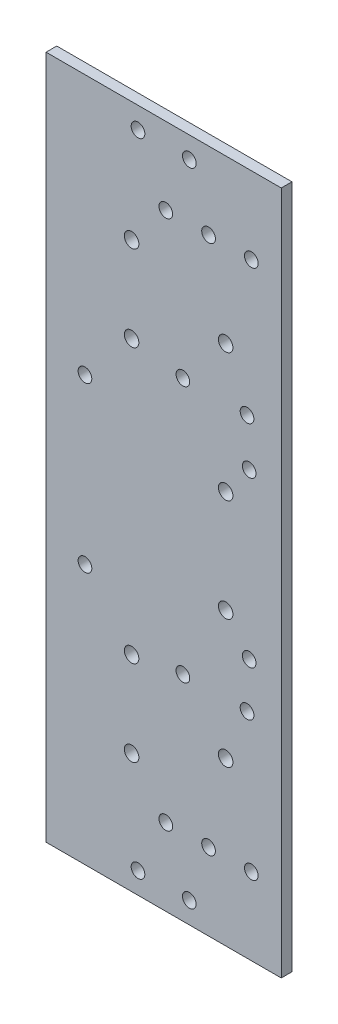
ISO-10303-21;
HEADER;
FILE_DESCRIPTION(('STEP AP214'),'2;1');
FILE_NAME('part.step','',(''),(''),'','','');
FILE_SCHEMA(('AUTOMOTIVE_DESIGN { 1 0 10303 214 1 1 1 1 }'));
ENDSEC;
DATA;
#1=APPLICATION_CONTEXT('core data for automotive mechanical design processes');
#2=APPLICATION_PROTOCOL_DEFINITION('international standard','automotive_design',2000,#1);
#3=PRODUCT_CONTEXT('',#1,'mechanical');
#4=PRODUCT('Part','Part','',(#3));
#5=PRODUCT_RELATED_PRODUCT_CATEGORY('part','',(#4));
#6=PRODUCT_DEFINITION_FORMATION('','',#4);
#7=PRODUCT_DEFINITION_CONTEXT('part definition',#1,'design');
#8=PRODUCT_DEFINITION('design','',#6,#7);
#9=PRODUCT_DEFINITION_SHAPE('','',#8);
#10=(LENGTH_UNIT() NAMED_UNIT(*) SI_UNIT(.MILLI.,.METRE.));
#11=(NAMED_UNIT(*) PLANE_ANGLE_UNIT() SI_UNIT($,.RADIAN.));
#12=(NAMED_UNIT(*) SI_UNIT($,.STERADIAN.) SOLID_ANGLE_UNIT());
#13=UNCERTAINTY_MEASURE_WITH_UNIT(LENGTH_MEASURE(1.E-05),#10,'distance_accuracy_value','');
#14=(GEOMETRIC_REPRESENTATION_CONTEXT(3) GLOBAL_UNCERTAINTY_ASSIGNED_CONTEXT((#13)) GLOBAL_UNIT_ASSIGNED_CONTEXT((#10,
#11,#12)) REPRESENTATION_CONTEXT('',''));
#15=CARTESIAN_POINT('',(0.,0.,0.));
#16=DIRECTION('',(0.,0.,1.));
#17=DIRECTION('',(1.,0.,0.));
#18=AXIS2_PLACEMENT_3D('',#15,#16,#17);
#19=CARTESIAN_POINT('',(0.,0.,0.));
#20=DIRECTION('',(0.,1.,0.));
#21=DIRECTION('',(1.,0.,0.));
#22=AXIS2_PLACEMENT_3D('',#19,#20,#21);
#23=PLANE('',#22);
#24=DIRECTION('',(1.,0.,0.));
#25=VECTOR('',#24,1.);
#26=CARTESIAN_POINT('',(-25.,0.,-17.5));
#27=LINE('',#26,#25);
#28=CARTESIAN_POINT('',(-27.5,0.,-17.5));
#29=VERTEX_POINT('',#28);
#30=CARTESIAN_POINT('',(27.5,0.,-17.5));
#31=VERTEX_POINT('',#30);
#32=EDGE_CURVE('E112',#29,#31,#27,.T.);
#33=ORIENTED_EDGE('',*,*,#32,.F.);
#34=DIRECTION('',(0.,0.,1.));
#35=VECTOR('',#34,1.);
#36=CARTESIAN_POINT('',(-27.5,0.,0.));
#37=LINE('',#36,#35);
#38=CARTESIAN_POINT('',(-27.5,0.,-20.));
#39=VERTEX_POINT('',#38);
#40=EDGE_CURVE('E132',#39,#29,#37,.T.);
#41=ORIENTED_EDGE('',*,*,#40,.F.);
#42=DIRECTION('',(-1.,0.,0.));
#43=VECTOR('',#42,1.);
#44=CARTESIAN_POINT('',(-27.5,0.,-20.));
#45=LINE('',#44,#43);
#46=CARTESIAN_POINT('',(27.5,0.,-20.));
#47=VERTEX_POINT('',#46);
#48=EDGE_CURVE('E520',#47,#39,#45,.T.);
#49=ORIENTED_EDGE('',*,*,#48,.F.);
#50=DIRECTION('',(0.,0.,-1.));
#51=VECTOR('',#50,1.);
#52=CARTESIAN_POINT('',(27.5,0.,0.));
#53=LINE('',#52,#51);
#54=EDGE_CURVE('E85',#31,#47,#53,.T.);
#55=ORIENTED_EDGE('',*,*,#54,.F.);
#56=EDGE_LOOP('',(#33,#41,#49,#55));
#57=FACE_BOUND('',#56,.T.);
#58=ADVANCED_FACE('F60',(#57),#23,.F.);
#59=CARTESIAN_POINT('',(0.,160.,0.));
#60=DIRECTION('',(0.,1.,0.));
#61=DIRECTION('',(1.,0.,0.));
#62=AXIS2_PLACEMENT_3D('',#59,#60,#61);
#63=PLANE('',#62);
#64=DIRECTION('',(0.,0.,1.));
#65=VECTOR('',#64,1.);
#66=CARTESIAN_POINT('',(-27.5,160.,0.));
#67=LINE('',#66,#65);
#68=CARTESIAN_POINT('',(-27.5,160.,-20.));
#69=VERTEX_POINT('',#68);
#70=CARTESIAN_POINT('',(-27.5,160.,-17.5));
#71=VERTEX_POINT('',#70);
#72=EDGE_CURVE('E107',#69,#71,#67,.T.);
#73=ORIENTED_EDGE('',*,*,#72,.T.);
#74=DIRECTION('',(1.,0.,0.));
#75=VECTOR('',#74,1.);
#76=CARTESIAN_POINT('',(-25.,160.,-17.5));
#77=LINE('',#76,#75);
#78=CARTESIAN_POINT('',(27.5,160.,-17.5));
#79=VERTEX_POINT('',#78);
#80=EDGE_CURVE('E104',#71,#79,#77,.T.);
#81=ORIENTED_EDGE('',*,*,#80,.T.);
#82=DIRECTION('',(0.,0.,-1.));
#83=VECTOR('',#82,1.);
#84=CARTESIAN_POINT('',(27.5,160.,0.));
#85=LINE('',#84,#83);
#86=CARTESIAN_POINT('',(27.5,160.,-20.));
#87=VERTEX_POINT('',#86);
#88=EDGE_CURVE('E78',#79,#87,#85,.T.);
#89=ORIENTED_EDGE('',*,*,#88,.T.);
#90=DIRECTION('',(-1.,0.,0.));
#91=VECTOR('',#90,1.);
#92=CARTESIAN_POINT('',(-27.5,160.,-20.));
#93=LINE('',#92,#91);
#94=EDGE_CURVE('E127',#87,#69,#93,.T.);
#95=ORIENTED_EDGE('',*,*,#94,.T.);
#96=EDGE_LOOP('',(#73,#81,#89,#95));
#97=FACE_BOUND('',#96,.T.);
#98=ADVANCED_FACE('F106',(#97),#63,.T.);
#99=CARTESIAN_POINT('',(-27.5,160.,0.));
#100=DIRECTION('',(1.,0.,0.));
#101=DIRECTION('',(0.,1.,0.));
#102=AXIS2_PLACEMENT_3D('',#99,#100,#101);
#103=PLANE('',#102);
#104=DIRECTION('',(0.,-1.,0.));
#105=VECTOR('',#104,1.);
#106=CARTESIAN_POINT('',(-27.5,160.,-17.5));
#107=LINE('',#106,#105);
#108=EDGE_CURVE('E116',#71,#29,#107,.T.);
#109=ORIENTED_EDGE('',*,*,#108,.F.);
#110=ORIENTED_EDGE('',*,*,#72,.F.);
#111=DIRECTION('',(0.,-1.,0.));
#112=VECTOR('',#111,1.);
#113=CARTESIAN_POINT('',(-27.5,160.,-20.));
#114=LINE('',#113,#112);
#115=EDGE_CURVE('E70',#39,#69,#114,.F.);
#116=ORIENTED_EDGE('',*,*,#115,.F.);
#117=ORIENTED_EDGE('',*,*,#40,.T.);
#118=EDGE_LOOP('',(#109,#110,#116,#117));
#119=FACE_BOUND('',#118,.T.);
#120=ADVANCED_FACE('F1743',(#119),#103,.F.);
#121=CARTESIAN_POINT('',(27.5,160.,0.));
#122=DIRECTION('',(-1.,0.,0.));
#123=DIRECTION('',(0.,0.,1.));
#124=AXIS2_PLACEMENT_3D('',#121,#122,#123);
#125=PLANE('',#124);
#126=DIRECTION('',(0.,1.,0.));
#127=VECTOR('',#126,1.);
#128=CARTESIAN_POINT('',(27.5,0.,-17.5));
#129=LINE('',#128,#127);
#130=EDGE_CURVE('E114',#31,#79,#129,.T.);
#131=ORIENTED_EDGE('',*,*,#130,.F.);
#132=ORIENTED_EDGE('',*,*,#54,.T.);
#133=DIRECTION('',(0.,-1.,0.));
#134=VECTOR('',#133,1.);
#135=CARTESIAN_POINT('',(27.5,160.,-20.));
#136=LINE('',#135,#134);
#137=EDGE_CURVE('E12',#47,#87,#136,.F.);
#138=ORIENTED_EDGE('',*,*,#137,.T.);
#139=ORIENTED_EDGE('',*,*,#88,.F.);
#140=EDGE_LOOP('',(#131,#132,#138,#139));
#141=FACE_BOUND('',#140,.T.);
#142=ADVANCED_FACE('F119',(#141),#125,.F.);
#143=CARTESIAN_POINT('',(-27.5,160.,-20.));
#144=DIRECTION('',(0.,0.,1.));
#145=DIRECTION('',(1.,0.,0.));
#146=AXIS2_PLACEMENT_3D('',#143,#144,#145);
#147=PLANE('',#146);
#148=CARTESIAN_POINT('',(14.5,38.,-20.));
#149=DIRECTION('',(0.,0.,-1.));
#150=DIRECTION('',(-1.,0.,0.));
#151=AXIS2_PLACEMENT_3D('',#148,#149,#150);
#152=CIRCLE('',#151,1.7);
#153=CARTESIAN_POINT('',(12.8,38.,-20.));
#154=VERTEX_POINT('',#153);
#155=EDGE_CURVE('E3857',#154,#154,#152,.T.);
#156=ORIENTED_EDGE('',*,*,#155,.F.);
#157=EDGE_LOOP('',(#156));
#158=FACE_BOUND('',#157,.T.);
#159=CARTESIAN_POINT('',(14.5,68.,-20.));
#160=DIRECTION('',(0.,0.,-1.));
#161=DIRECTION('',(-1.,0.,0.));
#162=AXIS2_PLACEMENT_3D('',#159,#160,#161);
#163=CIRCLE('',#162,1.7);
#164=CARTESIAN_POINT('',(12.8,68.,-20.));
#165=VERTEX_POINT('',#164);
#166=EDGE_CURVE('E3852',#165,#165,#163,.T.);
#167=ORIENTED_EDGE('',*,*,#166,.F.);
#168=EDGE_LOOP('',(#167));
#169=FACE_BOUND('',#168,.T.);
#170=CARTESIAN_POINT('',(14.5,122.,-20.));
#171=DIRECTION('',(0.,0.,-1.));
#172=DIRECTION('',(-1.,0.,0.));
#173=AXIS2_PLACEMENT_3D('',#170,#171,#172);
#174=CIRCLE('',#173,1.7);
#175=CARTESIAN_POINT('',(12.8,122.,-20.));
#176=VERTEX_POINT('',#175);
#177=EDGE_CURVE('E3870',#176,#176,#174,.T.);
#178=ORIENTED_EDGE('',*,*,#177,.F.);
#179=EDGE_LOOP('',(#178));
#180=FACE_BOUND('',#179,.T.);
#181=CARTESIAN_POINT('',(14.5,92.,-20.));
#182=DIRECTION('',(0.,0.,-1.));
#183=DIRECTION('',(-1.,0.,0.));
#184=AXIS2_PLACEMENT_3D('',#181,#182,#183);
#185=CIRCLE('',#184,1.7);
#186=CARTESIAN_POINT('',(12.8,92.,-20.));
#187=VERTEX_POINT('',#186);
#188=EDGE_CURVE('E3859',#187,#187,#185,.T.);
#189=ORIENTED_EDGE('',*,*,#188,.F.);
#190=EDGE_LOOP('',(#189));
#191=FACE_BOUND('',#190,.T.);
#192=CARTESIAN_POINT('',(-7.5,28.,-20.));
#193=DIRECTION('',(0.,0.,-1.));
#194=DIRECTION('',(-1.,0.,0.));
#195=AXIS2_PLACEMENT_3D('',#192,#193,#194);
#196=CIRCLE('',#195,1.7);
#197=CARTESIAN_POINT('',(-9.2,28.,-20.));
#198=VERTEX_POINT('',#197);
#199=EDGE_CURVE('E3878',#198,#198,#196,.T.);
#200=ORIENTED_EDGE('',*,*,#199,.F.);
#201=EDGE_LOOP('',(#200));
#202=FACE_BOUND('',#201,.T.);
#203=CARTESIAN_POINT('',(-7.5,48.,-20.));
#204=DIRECTION('',(0.,0.,-1.));
#205=DIRECTION('',(-1.,0.,0.));
#206=AXIS2_PLACEMENT_3D('',#203,#204,#205);
#207=CIRCLE('',#206,1.7);
#208=CARTESIAN_POINT('',(-9.2,48.,-20.));
#209=VERTEX_POINT('',#208);
#210=EDGE_CURVE('E3866',#209,#209,#207,.T.);
#211=ORIENTED_EDGE('',*,*,#210,.F.);
#212=EDGE_LOOP('',(#211));
#213=FACE_BOUND('',#212,.T.);
#214=CARTESIAN_POINT('',(-7.5,132.,-20.));
#215=DIRECTION('',(0.,0.,-1.));
#216=DIRECTION('',(-1.,0.,0.));
#217=AXIS2_PLACEMENT_3D('',#214,#215,#216);
#218=CIRCLE('',#217,1.70000000000001);
#219=CARTESIAN_POINT('',(-9.20000000000001,132.,-20.));
#220=VERTEX_POINT('',#219);
#221=EDGE_CURVE('E3883',#220,#220,#218,.T.);
#222=ORIENTED_EDGE('',*,*,#221,.F.);
#223=EDGE_LOOP('',(#222));
#224=FACE_BOUND('',#223,.T.);
#225=CARTESIAN_POINT('',(-7.5,112.,-20.));
#226=DIRECTION('',(0.,0.,-1.));
#227=DIRECTION('',(-1.,0.,0.));
#228=AXIS2_PLACEMENT_3D('',#225,#226,#227);
#229=CIRCLE('',#228,1.70000000000001);
#230=CARTESIAN_POINT('',(-9.20000000000001,112.,-20.));
#231=VERTEX_POINT('',#230);
#232=EDGE_CURVE('E3874',#231,#231,#229,.T.);
#233=ORIENTED_EDGE('',*,*,#232,.F.);
#234=EDGE_LOOP('',(#233));
#235=FACE_BOUND('',#234,.T.);
#236=CARTESIAN_POINT('',(6.,5.,-20.));
#237=DIRECTION('',(0.,0.,-1.));
#238=DIRECTION('',(-1.,0.,0.));
#239=AXIS2_PLACEMENT_3D('',#236,#237,#238);
#240=CIRCLE('',#239,1.6);
#241=CARTESIAN_POINT('',(4.4,5.,-20.));
#242=VERTEX_POINT('',#241);
#243=EDGE_CURVE('E191',#242,#242,#240,.T.);
#244=ORIENTED_EDGE('',*,*,#243,.F.);
#245=EDGE_LOOP('',(#244));
#246=FACE_BOUND('',#245,.T.);
#247=CARTESIAN_POINT('',(-6.,5.,-20.));
#248=DIRECTION('',(0.,0.,-1.));
#249=DIRECTION('',(1.,0.,0.));
#250=AXIS2_PLACEMENT_3D('',#247,#248,#249);
#251=CIRCLE('',#250,1.6);
#252=CARTESIAN_POINT('',(-4.4,5.,-20.));
#253=VERTEX_POINT('',#252);
#254=EDGE_CURVE('E457',#253,#253,#251,.T.);
#255=ORIENTED_EDGE('',*,*,#254,.F.);
#256=EDGE_LOOP('',(#255));
#257=FACE_BOUND('',#256,.T.);
#258=CARTESIAN_POINT('',(-6.,155.,-20.));
#259=DIRECTION('',(0.,0.,-1.));
#260=DIRECTION('',(-1.,0.,0.));
#261=AXIS2_PLACEMENT_3D('',#258,#259,#260);
#262=CIRCLE('',#261,1.6);
#263=CARTESIAN_POINT('',(-7.6,155.,-20.));
#264=VERTEX_POINT('',#263);
#265=EDGE_CURVE('E494',#264,#264,#262,.T.);
#266=ORIENTED_EDGE('',*,*,#265,.F.);
#267=EDGE_LOOP('',(#266));
#268=FACE_BOUND('',#267,.T.);
#269=CARTESIAN_POINT('',(6.,155.,-20.));
#270=DIRECTION('',(0.,0.,-1.));
#271=DIRECTION('',(1.,0.,0.));
#272=AXIS2_PLACEMENT_3D('',#269,#270,#271);
#273=CIRCLE('',#272,1.6);
#274=CARTESIAN_POINT('',(7.6,155.,-20.));
#275=VERTEX_POINT('',#274);
#276=EDGE_CURVE('E135',#275,#275,#273,.T.);
#277=ORIENTED_EDGE('',*,*,#276,.F.);
#278=EDGE_LOOP('',(#277));
#279=FACE_BOUND('',#278,.T.);
#280=CARTESIAN_POINT('',(0.500000000000007,18.,-20.));
#281=DIRECTION('',(0.,0.,-1.));
#282=DIRECTION('',(-1.,0.,0.));
#283=AXIS2_PLACEMENT_3D('',#280,#281,#282);
#284=CIRCLE('',#283,1.6);
#285=CARTESIAN_POINT('',(-1.09999999999999,18.,-20.));
#286=VERTEX_POINT('',#285);
#287=EDGE_CURVE('E458',#286,#286,#284,.T.);
#288=ORIENTED_EDGE('',*,*,#287,.F.);
#289=EDGE_LOOP('',(#288));
#290=FACE_BOUND('',#289,.T.);
#291=CARTESIAN_POINT('',(10.5,18.,-20.));
#292=DIRECTION('',(0.,0.,-1.));
#293=DIRECTION('',(-1.,0.,0.));
#294=AXIS2_PLACEMENT_3D('',#291,#292,#293);
#295=CIRCLE('',#294,1.6);
#296=CARTESIAN_POINT('',(8.9,18.,-20.));
#297=VERTEX_POINT('',#296);
#298=EDGE_CURVE('E571',#297,#297,#295,.T.);
#299=ORIENTED_EDGE('',*,*,#298,.F.);
#300=EDGE_LOOP('',(#299));
#301=FACE_BOUND('',#300,.T.);
#302=CARTESIAN_POINT('',(20.5,18.,-20.));
#303=DIRECTION('',(0.,0.,-1.));
#304=DIRECTION('',(-1.,0.,0.));
#305=AXIS2_PLACEMENT_3D('',#302,#303,#304);
#306=CIRCLE('',#305,1.6);
#307=CARTESIAN_POINT('',(18.9,18.,-20.));
#308=VERTEX_POINT('',#307);
#309=EDGE_CURVE('E595',#308,#308,#306,.T.);
#310=ORIENTED_EDGE('',*,*,#309,.F.);
#311=EDGE_LOOP('',(#310));
#312=FACE_BOUND('',#311,.T.);
#313=CARTESIAN_POINT('',(20.5,142.,-20.));
#314=DIRECTION('',(0.,0.,-1.));
#315=DIRECTION('',(1.,0.,0.));
#316=AXIS2_PLACEMENT_3D('',#313,#314,#315);
#317=CIRCLE('',#316,1.6);
#318=CARTESIAN_POINT('',(22.1,142.,-20.));
#319=VERTEX_POINT('',#318);
#320=EDGE_CURVE('E623',#319,#319,#317,.T.);
#321=ORIENTED_EDGE('',*,*,#320,.F.);
#322=EDGE_LOOP('',(#321));
#323=FACE_BOUND('',#322,.T.);
#324=CARTESIAN_POINT('',(10.5,142.,-20.));
#325=DIRECTION('',(0.,0.,-1.));
#326=DIRECTION('',(1.,0.,0.));
#327=AXIS2_PLACEMENT_3D('',#324,#325,#326);
#328=CIRCLE('',#327,1.6);
#329=CARTESIAN_POINT('',(12.1,142.,-20.));
#330=VERTEX_POINT('',#329);
#331=EDGE_CURVE('E650',#330,#330,#328,.T.);
#332=ORIENTED_EDGE('',*,*,#331,.F.);
#333=EDGE_LOOP('',(#332));
#334=FACE_BOUND('',#333,.T.);
#335=CARTESIAN_POINT('',(0.500000000000007,142.,-20.));
#336=DIRECTION('',(0.,0.,-1.));
#337=DIRECTION('',(1.,0.,0.));
#338=AXIS2_PLACEMENT_3D('',#335,#336,#337);
#339=CIRCLE('',#338,1.6);
#340=CARTESIAN_POINT('',(2.10000000000001,142.,-20.));
#341=VERTEX_POINT('',#340);
#342=EDGE_CURVE('E681',#341,#341,#339,.T.);
#343=ORIENTED_EDGE('',*,*,#342,.F.);
#344=EDGE_LOOP('',(#343));
#345=FACE_BOUND('',#344,.T.);
#346=CARTESIAN_POINT('',(19.5,110.,-20.));
#347=DIRECTION('',(0.,0.,-1.));
#348=DIRECTION('',(-1.,0.,0.));
#349=AXIS2_PLACEMENT_3D('',#346,#347,#348);
#350=CIRCLE('',#349,1.6);
#351=CARTESIAN_POINT('',(17.9,110.,-20.));
#352=VERTEX_POINT('',#351);
#353=EDGE_CURVE('E1199',#352,#352,#350,.T.);
#354=ORIENTED_EDGE('',*,*,#353,.F.);
#355=EDGE_LOOP('',(#354));
#356=FACE_BOUND('',#355,.T.);
#357=CARTESIAN_POINT('',(4.5,110.,-20.));
#358=DIRECTION('',(0.,0.,-1.));
#359=DIRECTION('',(-1.,0.,0.));
#360=AXIS2_PLACEMENT_3D('',#357,#358,#359);
#361=CIRCLE('',#360,1.6);
#362=CARTESIAN_POINT('',(2.9,110.,-20.));
#363=VERTEX_POINT('',#362);
#364=EDGE_CURVE('E1010',#363,#363,#361,.T.);
#365=ORIENTED_EDGE('',*,*,#364,.F.);
#366=EDGE_LOOP('',(#365));
#367=FACE_BOUND('',#366,.T.);
#368=CARTESIAN_POINT('',(4.5,50.,-20.));
#369=DIRECTION('',(0.,0.,-1.));
#370=DIRECTION('',(1.,0.,0.));
#371=AXIS2_PLACEMENT_3D('',#368,#369,#370);
#372=CIRCLE('',#371,1.6);
#373=CARTESIAN_POINT('',(6.1,50.,-20.));
#374=VERTEX_POINT('',#373);
#375=EDGE_CURVE('E1012',#374,#374,#372,.T.);
#376=ORIENTED_EDGE('',*,*,#375,.F.);
#377=EDGE_LOOP('',(#376));
#378=FACE_BOUND('',#377,.T.);
#379=CARTESIAN_POINT('',(19.5,50.,-20.));
#380=DIRECTION('',(0.,0.,-1.));
#381=DIRECTION('',(1.,0.,0.));
#382=AXIS2_PLACEMENT_3D('',#379,#380,#381);
#383=CIRCLE('',#382,1.6);
#384=CARTESIAN_POINT('',(21.1,50.,-20.));
#385=VERTEX_POINT('',#384);
#386=EDGE_CURVE('E745',#385,#385,#383,.T.);
#387=ORIENTED_EDGE('',*,*,#386,.F.);
#388=EDGE_LOOP('',(#387));
#389=FACE_BOUND('',#388,.T.);
#390=CARTESIAN_POINT('',(20.,99.2,-20.));
#391=DIRECTION('',(0.,0.,-1.));
#392=DIRECTION('',(-1.,0.,0.));
#393=AXIS2_PLACEMENT_3D('',#390,#391,#392);
#394=CIRCLE('',#393,1.6);
#395=CARTESIAN_POINT('',(18.4,99.2,-20.));
#396=VERTEX_POINT('',#395);
#397=EDGE_CURVE('E598',#396,#396,#394,.T.);
#398=ORIENTED_EDGE('',*,*,#397,.F.);
#399=EDGE_LOOP('',(#398));
#400=FACE_BOUND('',#399,.T.);
#401=CARTESIAN_POINT('',(-18.4,60.8,-20.));
#402=DIRECTION('',(0.,0.,-1.));
#403=DIRECTION('',(1.,0.,0.));
#404=AXIS2_PLACEMENT_3D('',#401,#402,#403);
#405=CIRCLE('',#404,1.6);
#406=CARTESIAN_POINT('',(-16.8,60.8,-20.));
#407=VERTEX_POINT('',#406);
#408=EDGE_CURVE('E680',#407,#407,#405,.T.);
#409=ORIENTED_EDGE('',*,*,#408,.F.);
#410=EDGE_LOOP('',(#409));
#411=FACE_BOUND('',#410,.T.);
#412=CARTESIAN_POINT('',(20.,60.8,-20.));
#413=DIRECTION('',(0.,0.,-1.));
#414=DIRECTION('',(1.,0.,0.));
#415=AXIS2_PLACEMENT_3D('',#412,#413,#414);
#416=CIRCLE('',#415,1.6);
#417=CARTESIAN_POINT('',(21.6,60.8,-20.));
#418=VERTEX_POINT('',#417);
#419=EDGE_CURVE('E497',#418,#418,#416,.T.);
#420=ORIENTED_EDGE('',*,*,#419,.F.);
#421=EDGE_LOOP('',(#420));
#422=FACE_BOUND('',#421,.T.);
#423=CARTESIAN_POINT('',(-18.4,99.2,-20.));
#424=DIRECTION('',(0.,0.,-1.));
#425=DIRECTION('',(-1.,0.,0.));
#426=AXIS2_PLACEMENT_3D('',#423,#424,#425);
#427=CIRCLE('',#426,1.6);
#428=CARTESIAN_POINT('',(-20.,99.2,-20.));
#429=VERTEX_POINT('',#428);
#430=EDGE_CURVE('E718',#429,#429,#427,.T.);
#431=ORIENTED_EDGE('',*,*,#430,.F.);
#432=EDGE_LOOP('',(#431));
#433=FACE_BOUND('',#432,.T.);
#434=ORIENTED_EDGE('',*,*,#94,.F.);
#435=ORIENTED_EDGE('',*,*,#137,.F.);
#436=ORIENTED_EDGE('',*,*,#48,.T.);
#437=ORIENTED_EDGE('',*,*,#115,.T.);
#438=EDGE_LOOP('',(#434,#435,#436,#437));
#439=FACE_BOUND('',#438,.T.);
#440=ADVANCED_FACE('F1737',(#158,#169,#180,#191,#202,#213,#224,#235,#246,#257,#268,#279,#290,
#301,#312,#323,#334,#345,#356,#367,#378,#389,#400,#411,#422,#433,#439),#147,.F.);
#441=CARTESIAN_POINT('',(-25.,160.,-17.5));
#442=DIRECTION('',(0.,0.,-1.));
#443=DIRECTION('',(0.,-1.,0.));
#444=AXIS2_PLACEMENT_3D('',#441,#442,#443);
#445=PLANE('',#444);
#446=CARTESIAN_POINT('',(14.5,38.,-17.5));
#447=DIRECTION('',(0.,0.,-1.));
#448=DIRECTION('',(-1.,0.,0.));
#449=AXIS2_PLACEMENT_3D('',#446,#447,#448);
#450=CIRCLE('',#449,1.7);
#451=CARTESIAN_POINT('',(12.8,38.,-17.5));
#452=VERTEX_POINT('',#451);
#453=EDGE_CURVE('E64',#452,#452,#450,.T.);
#454=ORIENTED_EDGE('',*,*,#453,.T.);
#455=EDGE_LOOP('',(#454));
#456=FACE_BOUND('',#455,.T.);
#457=CARTESIAN_POINT('',(14.5,68.,-17.5));
#458=DIRECTION('',(0.,0.,-1.));
#459=DIRECTION('',(-1.,0.,0.));
#460=AXIS2_PLACEMENT_3D('',#457,#458,#459);
#461=CIRCLE('',#460,1.7);
#462=CARTESIAN_POINT('',(12.8,68.,-17.5));
#463=VERTEX_POINT('',#462);
#464=EDGE_CURVE('E3855',#463,#463,#461,.T.);
#465=ORIENTED_EDGE('',*,*,#464,.T.);
#466=EDGE_LOOP('',(#465));
#467=FACE_BOUND('',#466,.T.);
#468=CARTESIAN_POINT('',(14.5,122.,-17.5));
#469=DIRECTION('',(0.,0.,-1.));
#470=DIRECTION('',(-1.,0.,0.));
#471=AXIS2_PLACEMENT_3D('',#468,#469,#470);
#472=CIRCLE('',#471,1.7);
#473=CARTESIAN_POINT('',(12.8,122.,-17.5));
#474=VERTEX_POINT('',#473);
#475=EDGE_CURVE('E3863',#474,#474,#472,.T.);
#476=ORIENTED_EDGE('',*,*,#475,.T.);
#477=EDGE_LOOP('',(#476));
#478=FACE_BOUND('',#477,.T.);
#479=CARTESIAN_POINT('',(14.5,92.,-17.5));
#480=DIRECTION('',(0.,0.,-1.));
#481=DIRECTION('',(-1.,0.,0.));
#482=AXIS2_PLACEMENT_3D('',#479,#480,#481);
#483=CIRCLE('',#482,1.7);
#484=CARTESIAN_POINT('',(12.8,92.,-17.5));
#485=VERTEX_POINT('',#484);
#486=EDGE_CURVE('E3867',#485,#485,#483,.T.);
#487=ORIENTED_EDGE('',*,*,#486,.T.);
#488=EDGE_LOOP('',(#487));
#489=FACE_BOUND('',#488,.T.);
#490=CARTESIAN_POINT('',(-7.5,28.,-17.5));
#491=DIRECTION('',(0.,0.,-1.));
#492=DIRECTION('',(-1.,0.,0.));
#493=AXIS2_PLACEMENT_3D('',#490,#491,#492);
#494=CIRCLE('',#493,1.7);
#495=CARTESIAN_POINT('',(-9.2,28.,-17.5));
#496=VERTEX_POINT('',#495);
#497=EDGE_CURVE('E3871',#496,#496,#494,.T.);
#498=ORIENTED_EDGE('',*,*,#497,.T.);
#499=EDGE_LOOP('',(#498));
#500=FACE_BOUND('',#499,.T.);
#501=CARTESIAN_POINT('',(-7.5,48.,-17.5));
#502=DIRECTION('',(0.,0.,-1.));
#503=DIRECTION('',(-1.,0.,0.));
#504=AXIS2_PLACEMENT_3D('',#501,#502,#503);
#505=CIRCLE('',#504,1.7);
#506=CARTESIAN_POINT('',(-9.2,48.,-17.5));
#507=VERTEX_POINT('',#506);
#508=EDGE_CURVE('E3875',#507,#507,#505,.T.);
#509=ORIENTED_EDGE('',*,*,#508,.T.);
#510=EDGE_LOOP('',(#509));
#511=FACE_BOUND('',#510,.T.);
#512=CARTESIAN_POINT('',(-7.5,132.,-17.5));
#513=DIRECTION('',(0.,0.,-1.));
#514=DIRECTION('',(-1.,0.,0.));
#515=AXIS2_PLACEMENT_3D('',#512,#513,#514);
#516=CIRCLE('',#515,1.70000000000001);
#517=CARTESIAN_POINT('',(-9.20000000000001,132.,-17.5));
#518=VERTEX_POINT('',#517);
#519=EDGE_CURVE('E117',#518,#518,#516,.T.);
#520=ORIENTED_EDGE('',*,*,#519,.T.);
#521=EDGE_LOOP('',(#520));
#522=FACE_BOUND('',#521,.T.);
#523=CARTESIAN_POINT('',(-7.5,112.,-17.5));
#524=DIRECTION('',(0.,0.,-1.));
#525=DIRECTION('',(-1.,0.,0.));
#526=AXIS2_PLACEMENT_3D('',#523,#524,#525);
#527=CIRCLE('',#526,1.70000000000001);
#528=CARTESIAN_POINT('',(-9.20000000000001,112.,-17.5));
#529=VERTEX_POINT('',#528);
#530=EDGE_CURVE('E3881',#529,#529,#527,.T.);
#531=ORIENTED_EDGE('',*,*,#530,.T.);
#532=EDGE_LOOP('',(#531));
#533=FACE_BOUND('',#532,.T.);
#534=CARTESIAN_POINT('',(6.,5.,-17.5));
#535=DIRECTION('',(0.,0.,-1.));
#536=DIRECTION('',(-1.,0.,0.));
#537=AXIS2_PLACEMENT_3D('',#534,#535,#536);
#538=CIRCLE('',#537,1.6);
#539=CARTESIAN_POINT('',(4.4,5.,-17.5));
#540=VERTEX_POINT('',#539);
#541=EDGE_CURVE('E451',#540,#540,#538,.T.);
#542=ORIENTED_EDGE('',*,*,#541,.T.);
#543=EDGE_LOOP('',(#542));
#544=FACE_BOUND('',#543,.T.);
#545=CARTESIAN_POINT('',(-6.,5.,-17.5));
#546=DIRECTION('',(0.,0.,-1.));
#547=DIRECTION('',(-1.,0.,0.));
#548=AXIS2_PLACEMENT_3D('',#545,#546,#547);
#549=CIRCLE('',#548,1.6);
#550=CARTESIAN_POINT('',(-7.6,5.,-17.5));
#551=VERTEX_POINT('',#550);
#552=EDGE_CURVE('E490',#551,#551,#549,.T.);
#553=ORIENTED_EDGE('',*,*,#552,.T.);
#554=EDGE_LOOP('',(#553));
#555=FACE_BOUND('',#554,.T.);
#556=CARTESIAN_POINT('',(-6.,155.,-17.5));
#557=DIRECTION('',(0.,0.,-1.));
#558=DIRECTION('',(-1.,0.,0.));
#559=AXIS2_PLACEMENT_3D('',#556,#557,#558);
#560=CIRCLE('',#559,1.6);
#561=CARTESIAN_POINT('',(-7.6,155.,-17.5));
#562=VERTEX_POINT('',#561);
#563=EDGE_CURVE('E514',#562,#562,#560,.T.);
#564=ORIENTED_EDGE('',*,*,#563,.T.);
#565=EDGE_LOOP('',(#564));
#566=FACE_BOUND('',#565,.T.);
#567=CARTESIAN_POINT('',(6.,155.,-17.5));
#568=DIRECTION('',(0.,0.,-1.));
#569=DIRECTION('',(-1.,0.,0.));
#570=AXIS2_PLACEMENT_3D('',#567,#568,#569);
#571=CIRCLE('',#570,1.6);
#572=CARTESIAN_POINT('',(4.4,155.,-17.5));
#573=VERTEX_POINT('',#572);
#574=EDGE_CURVE('E542',#573,#573,#571,.T.);
#575=ORIENTED_EDGE('',*,*,#574,.T.);
#576=EDGE_LOOP('',(#575));
#577=FACE_BOUND('',#576,.T.);
#578=CARTESIAN_POINT('',(0.500000000000007,18.,-17.5));
#579=DIRECTION('',(0.,0.,-1.));
#580=DIRECTION('',(-1.,0.,0.));
#581=AXIS2_PLACEMENT_3D('',#578,#579,#580);
#582=CIRCLE('',#581,1.6);
#583=CARTESIAN_POINT('',(-1.09999999999999,18.,-17.5));
#584=VERTEX_POINT('',#583);
#585=EDGE_CURVE('E565',#584,#584,#582,.T.);
#586=ORIENTED_EDGE('',*,*,#585,.T.);
#587=EDGE_LOOP('',(#586));
#588=FACE_BOUND('',#587,.T.);
#589=CARTESIAN_POINT('',(10.5,18.,-17.5));
#590=DIRECTION('',(0.,0.,-1.));
#591=DIRECTION('',(-1.,0.,0.));
#592=AXIS2_PLACEMENT_3D('',#589,#590,#591);
#593=CIRCLE('',#592,1.6);
#594=CARTESIAN_POINT('',(8.9,18.,-17.5));
#595=VERTEX_POINT('',#594);
#596=EDGE_CURVE('E590',#595,#595,#593,.T.);
#597=ORIENTED_EDGE('',*,*,#596,.T.);
#598=EDGE_LOOP('',(#597));
#599=FACE_BOUND('',#598,.T.);
#600=CARTESIAN_POINT('',(20.5,18.,-17.5));
#601=DIRECTION('',(0.,0.,-1.));
#602=DIRECTION('',(-1.,0.,0.));
#603=AXIS2_PLACEMENT_3D('',#600,#601,#602);
#604=CIRCLE('',#603,1.6);
#605=CARTESIAN_POINT('',(18.9,18.,-17.5));
#606=VERTEX_POINT('',#605);
#607=EDGE_CURVE('E617',#606,#606,#604,.T.);
#608=ORIENTED_EDGE('',*,*,#607,.T.);
#609=EDGE_LOOP('',(#608));
#610=FACE_BOUND('',#609,.T.);
#611=CARTESIAN_POINT('',(20.5,142.,-17.5));
#612=DIRECTION('',(0.,0.,-1.));
#613=DIRECTION('',(-1.,0.,0.));
#614=AXIS2_PLACEMENT_3D('',#611,#612,#613);
#615=CIRCLE('',#614,1.6);
#616=CARTESIAN_POINT('',(18.9,142.,-17.5));
#617=VERTEX_POINT('',#616);
#618=EDGE_CURVE('E644',#617,#617,#615,.T.);
#619=ORIENTED_EDGE('',*,*,#618,.T.);
#620=EDGE_LOOP('',(#619));
#621=FACE_BOUND('',#620,.T.);
#622=CARTESIAN_POINT('',(10.5,142.,-17.5));
#623=DIRECTION('',(0.,0.,-1.));
#624=DIRECTION('',(-1.,0.,0.));
#625=AXIS2_PLACEMENT_3D('',#622,#623,#624);
#626=CIRCLE('',#625,1.6);
#627=CARTESIAN_POINT('',(8.9,142.,-17.5));
#628=VERTEX_POINT('',#627);
#629=EDGE_CURVE('E460',#628,#628,#626,.T.);
#630=ORIENTED_EDGE('',*,*,#629,.T.);
#631=EDGE_LOOP('',(#630));
#632=FACE_BOUND('',#631,.T.);
#633=CARTESIAN_POINT('',(0.500000000000007,142.,-17.5));
#634=DIRECTION('',(0.,0.,-1.));
#635=DIRECTION('',(-1.,0.,0.));
#636=AXIS2_PLACEMENT_3D('',#633,#634,#635);
#637=CIRCLE('',#636,1.6);
#638=CARTESIAN_POINT('',(-1.09999999999999,142.,-17.5));
#639=VERTEX_POINT('',#638);
#640=EDGE_CURVE('E523',#639,#639,#637,.T.);
#641=ORIENTED_EDGE('',*,*,#640,.T.);
#642=EDGE_LOOP('',(#641));
#643=FACE_BOUND('',#642,.T.);
#644=CARTESIAN_POINT('',(19.5,110.,-17.5));
#645=DIRECTION('',(0.,0.,-1.));
#646=DIRECTION('',(-1.,0.,0.));
#647=AXIS2_PLACEMENT_3D('',#644,#645,#646);
#648=CIRCLE('',#647,1.6);
#649=CARTESIAN_POINT('',(17.9,110.,-17.5));
#650=VERTEX_POINT('',#649);
#651=EDGE_CURVE('E651',#650,#650,#648,.T.);
#652=ORIENTED_EDGE('',*,*,#651,.T.);
#653=EDGE_LOOP('',(#652));
#654=FACE_BOUND('',#653,.T.);
#655=CARTESIAN_POINT('',(4.5,110.,-17.5));
#656=DIRECTION('',(0.,0.,-1.));
#657=DIRECTION('',(-1.,0.,0.));
#658=AXIS2_PLACEMENT_3D('',#655,#656,#657);
#659=CIRCLE('',#658,1.6);
#660=CARTESIAN_POINT('',(2.9,110.,-17.5));
#661=VERTEX_POINT('',#660);
#662=EDGE_CURVE('E194',#661,#661,#659,.T.);
#663=ORIENTED_EDGE('',*,*,#662,.T.);
#664=EDGE_LOOP('',(#663));
#665=FACE_BOUND('',#664,.T.);
#666=CARTESIAN_POINT('',(4.5,50.,-17.5));
#667=DIRECTION('',(0.,0.,-1.));
#668=DIRECTION('',(-1.,0.,0.));
#669=AXIS2_PLACEMENT_3D('',#666,#667,#668);
#670=CIRCLE('',#669,1.6);
#671=CARTESIAN_POINT('',(2.9,50.,-17.5));
#672=VERTEX_POINT('',#671);
#673=EDGE_CURVE('E624',#672,#672,#670,.T.);
#674=ORIENTED_EDGE('',*,*,#673,.T.);
#675=EDGE_LOOP('',(#674));
#676=FACE_BOUND('',#675,.T.);
#677=CARTESIAN_POINT('',(19.5,50.,-17.5));
#678=DIRECTION('',(0.,0.,-1.));
#679=DIRECTION('',(-1.,0.,0.));
#680=AXIS2_PLACEMENT_3D('',#677,#678,#679);
#681=CIRCLE('',#680,1.6);
#682=CARTESIAN_POINT('',(17.9,50.,-17.5));
#683=VERTEX_POINT('',#682);
#684=EDGE_CURVE('E572',#683,#683,#681,.T.);
#685=ORIENTED_EDGE('',*,*,#684,.T.);
#686=EDGE_LOOP('',(#685));
#687=FACE_BOUND('',#686,.T.);
#688=CARTESIAN_POINT('',(20.,99.2,-17.5));
#689=DIRECTION('',(0.,0.,-1.));
#690=DIRECTION('',(-1.,0.,0.));
#691=AXIS2_PLACEMENT_3D('',#688,#689,#690);
#692=CIRCLE('',#691,1.6);
#693=CARTESIAN_POINT('',(18.4,99.2,-17.5));
#694=VERTEX_POINT('',#693);
#695=EDGE_CURVE('E676',#694,#694,#692,.T.);
#696=ORIENTED_EDGE('',*,*,#695,.T.);
#697=EDGE_LOOP('',(#696));
#698=FACE_BOUND('',#697,.T.);
#699=CARTESIAN_POINT('',(-18.4,60.8,-17.5));
#700=DIRECTION('',(0.,0.,-1.));
#701=DIRECTION('',(-1.,0.,0.));
#702=AXIS2_PLACEMENT_3D('',#699,#700,#701);
#703=CIRCLE('',#702,1.6);
#704=CARTESIAN_POINT('',(-20.,60.8,-17.5));
#705=VERTEX_POINT('',#704);
#706=EDGE_CURVE('E596',#705,#705,#703,.T.);
#707=ORIENTED_EDGE('',*,*,#706,.T.);
#708=EDGE_LOOP('',(#707));
#709=FACE_BOUND('',#708,.T.);
#710=CARTESIAN_POINT('',(20.,60.8,-17.5));
#711=DIRECTION('',(0.,0.,-1.));
#712=DIRECTION('',(-1.,0.,0.));
#713=AXIS2_PLACEMENT_3D('',#710,#711,#712);
#714=CIRCLE('',#713,1.6);
#715=CARTESIAN_POINT('',(18.4,60.8,-17.5));
#716=VERTEX_POINT('',#715);
#717=EDGE_CURVE('E713',#716,#716,#714,.T.);
#718=ORIENTED_EDGE('',*,*,#717,.T.);
#719=EDGE_LOOP('',(#718));
#720=FACE_BOUND('',#719,.T.);
#721=CARTESIAN_POINT('',(-18.4,99.2,-17.5));
#722=DIRECTION('',(0.,0.,-1.));
#723=DIRECTION('',(-1.,0.,0.));
#724=AXIS2_PLACEMENT_3D('',#721,#722,#723);
#725=CIRCLE('',#724,1.6);
#726=CARTESIAN_POINT('',(-20.,99.2,-17.5));
#727=VERTEX_POINT('',#726);
#728=EDGE_CURVE('E741',#727,#727,#725,.T.);
#729=ORIENTED_EDGE('',*,*,#728,.T.);
#730=EDGE_LOOP('',(#729));
#731=FACE_BOUND('',#730,.T.);
#732=ORIENTED_EDGE('',*,*,#32,.T.);
#733=ORIENTED_EDGE('',*,*,#130,.T.);
#734=ORIENTED_EDGE('',*,*,#80,.F.);
#735=ORIENTED_EDGE('',*,*,#108,.T.);
#736=EDGE_LOOP('',(#732,#733,#734,#735));
#737=FACE_BOUND('',#736,.T.);
#738=ADVANCED_FACE('F115',(#456,#467,#478,#489,#500,#511,#522,#533,#544,#555,#566,#577,#588,
#599,#610,#621,#632,#643,#654,#665,#676,#687,#698,#709,#720,#731,#737),#445,.F.);
#739=CARTESIAN_POINT('',(6.,5.,0.));
#740=DIRECTION('',(0.,0.,-1.));
#741=DIRECTION('',(-1.,0.,0.));
#742=AXIS2_PLACEMENT_3D('',#739,#740,#741);
#743=CYLINDRICAL_SURFACE('',#742,1.6);
#744=ORIENTED_EDGE('',*,*,#243,.T.);
#745=EDGE_LOOP('',(#744));
#746=FACE_BOUND('',#745,.T.);
#747=ORIENTED_EDGE('',*,*,#541,.F.);
#748=EDGE_LOOP('',(#747));
#749=FACE_BOUND('',#748,.T.);
#750=ADVANCED_FACE('F2057',(#746,#749),#743,.F.);
#751=CARTESIAN_POINT('',(-6.,5.,0.));
#752=DIRECTION('',(0.,0.,-1.));
#753=DIRECTION('',(-1.,0.,0.));
#754=AXIS2_PLACEMENT_3D('',#751,#752,#753);
#755=CYLINDRICAL_SURFACE('',#754,1.6);
#756=ORIENTED_EDGE('',*,*,#254,.T.);
#757=EDGE_LOOP('',(#756));
#758=FACE_BOUND('',#757,.T.);
#759=ORIENTED_EDGE('',*,*,#552,.F.);
#760=EDGE_LOOP('',(#759));
#761=FACE_BOUND('',#760,.T.);
#762=ADVANCED_FACE('F2070',(#758,#761),#755,.F.);
#763=CARTESIAN_POINT('',(-6.,155.,0.));
#764=DIRECTION('',(0.,0.,-1.));
#765=DIRECTION('',(-1.,0.,0.));
#766=AXIS2_PLACEMENT_3D('',#763,#764,#765);
#767=CYLINDRICAL_SURFACE('',#766,1.6);
#768=ORIENTED_EDGE('',*,*,#265,.T.);
#769=EDGE_LOOP('',(#768));
#770=FACE_BOUND('',#769,.T.);
#771=ORIENTED_EDGE('',*,*,#563,.F.);
#772=EDGE_LOOP('',(#771));
#773=FACE_BOUND('',#772,.T.);
#774=ADVANCED_FACE('F2083',(#770,#773),#767,.F.);
#775=CARTESIAN_POINT('',(6.,155.,0.));
#776=DIRECTION('',(0.,0.,-1.));
#777=DIRECTION('',(-1.,0.,0.));
#778=AXIS2_PLACEMENT_3D('',#775,#776,#777);
#779=CYLINDRICAL_SURFACE('',#778,1.6);
#780=ORIENTED_EDGE('',*,*,#276,.T.);
#781=EDGE_LOOP('',(#780));
#782=FACE_BOUND('',#781,.T.);
#783=ORIENTED_EDGE('',*,*,#574,.F.);
#784=EDGE_LOOP('',(#783));
#785=FACE_BOUND('',#784,.T.);
#786=ADVANCED_FACE('F2096',(#782,#785),#779,.F.);
#787=CARTESIAN_POINT('',(0.500000000000007,18.,0.));
#788=DIRECTION('',(0.,0.,-1.));
#789=DIRECTION('',(-1.,0.,0.));
#790=AXIS2_PLACEMENT_3D('',#787,#788,#789);
#791=CYLINDRICAL_SURFACE('',#790,1.6);
#792=ORIENTED_EDGE('',*,*,#287,.T.);
#793=EDGE_LOOP('',(#792));
#794=FACE_BOUND('',#793,.T.);
#795=ORIENTED_EDGE('',*,*,#585,.F.);
#796=EDGE_LOOP('',(#795));
#797=FACE_BOUND('',#796,.T.);
#798=ADVANCED_FACE('F2109',(#794,#797),#791,.F.);
#799=CARTESIAN_POINT('',(10.5,18.,0.));
#800=DIRECTION('',(0.,0.,-1.));
#801=DIRECTION('',(-1.,0.,0.));
#802=AXIS2_PLACEMENT_3D('',#799,#800,#801);
#803=CYLINDRICAL_SURFACE('',#802,1.6);
#804=ORIENTED_EDGE('',*,*,#298,.T.);
#805=EDGE_LOOP('',(#804));
#806=FACE_BOUND('',#805,.T.);
#807=ORIENTED_EDGE('',*,*,#596,.F.);
#808=EDGE_LOOP('',(#807));
#809=FACE_BOUND('',#808,.T.);
#810=ADVANCED_FACE('F2122',(#806,#809),#803,.F.);
#811=CARTESIAN_POINT('',(20.5,18.,0.));
#812=DIRECTION('',(0.,0.,-1.));
#813=DIRECTION('',(-1.,0.,0.));
#814=AXIS2_PLACEMENT_3D('',#811,#812,#813);
#815=CYLINDRICAL_SURFACE('',#814,1.6);
#816=ORIENTED_EDGE('',*,*,#309,.T.);
#817=EDGE_LOOP('',(#816));
#818=FACE_BOUND('',#817,.T.);
#819=ORIENTED_EDGE('',*,*,#607,.F.);
#820=EDGE_LOOP('',(#819));
#821=FACE_BOUND('',#820,.T.);
#822=ADVANCED_FACE('F2135',(#818,#821),#815,.F.);
#823=CARTESIAN_POINT('',(20.5,142.,0.));
#824=DIRECTION('',(0.,0.,-1.));
#825=DIRECTION('',(-1.,0.,0.));
#826=AXIS2_PLACEMENT_3D('',#823,#824,#825);
#827=CYLINDRICAL_SURFACE('',#826,1.6);
#828=ORIENTED_EDGE('',*,*,#320,.T.);
#829=EDGE_LOOP('',(#828));
#830=FACE_BOUND('',#829,.T.);
#831=ORIENTED_EDGE('',*,*,#618,.F.);
#832=EDGE_LOOP('',(#831));
#833=FACE_BOUND('',#832,.T.);
#834=ADVANCED_FACE('F2148',(#830,#833),#827,.F.);
#835=CARTESIAN_POINT('',(10.5,142.,0.));
#836=DIRECTION('',(0.,0.,-1.));
#837=DIRECTION('',(-1.,0.,0.));
#838=AXIS2_PLACEMENT_3D('',#835,#836,#837);
#839=CYLINDRICAL_SURFACE('',#838,1.6);
#840=ORIENTED_EDGE('',*,*,#331,.T.);
#841=EDGE_LOOP('',(#840));
#842=FACE_BOUND('',#841,.T.);
#843=ORIENTED_EDGE('',*,*,#629,.F.);
#844=EDGE_LOOP('',(#843));
#845=FACE_BOUND('',#844,.T.);
#846=ADVANCED_FACE('F62',(#842,#845),#839,.F.);
#847=CARTESIAN_POINT('',(0.500000000000007,142.,0.));
#848=DIRECTION('',(0.,0.,-1.));
#849=DIRECTION('',(-1.,0.,0.));
#850=AXIS2_PLACEMENT_3D('',#847,#848,#849);
#851=CYLINDRICAL_SURFACE('',#850,1.6);
#852=ORIENTED_EDGE('',*,*,#342,.T.);
#853=EDGE_LOOP('',(#852));
#854=FACE_BOUND('',#853,.T.);
#855=ORIENTED_EDGE('',*,*,#640,.F.);
#856=EDGE_LOOP('',(#855));
#857=FACE_BOUND('',#856,.T.);
#858=ADVANCED_FACE('F2173',(#854,#857),#851,.F.);
#859=CARTESIAN_POINT('',(19.5,110.,0.));
#860=DIRECTION('',(0.,0.,-1.));
#861=DIRECTION('',(-1.,0.,0.));
#862=AXIS2_PLACEMENT_3D('',#859,#860,#861);
#863=CYLINDRICAL_SURFACE('',#862,1.6);
#864=ORIENTED_EDGE('',*,*,#353,.T.);
#865=EDGE_LOOP('',(#864));
#866=FACE_BOUND('',#865,.T.);
#867=ORIENTED_EDGE('',*,*,#651,.F.);
#868=EDGE_LOOP('',(#867));
#869=FACE_BOUND('',#868,.T.);
#870=ADVANCED_FACE('F2185',(#866,#869),#863,.F.);
#871=CARTESIAN_POINT('',(4.5,110.,0.));
#872=DIRECTION('',(0.,0.,-1.));
#873=DIRECTION('',(-1.,0.,0.));
#874=AXIS2_PLACEMENT_3D('',#871,#872,#873);
#875=CYLINDRICAL_SURFACE('',#874,1.6);
#876=ORIENTED_EDGE('',*,*,#364,.T.);
#877=EDGE_LOOP('',(#876));
#878=FACE_BOUND('',#877,.T.);
#879=ORIENTED_EDGE('',*,*,#662,.F.);
#880=EDGE_LOOP('',(#879));
#881=FACE_BOUND('',#880,.T.);
#882=ADVANCED_FACE('F2198',(#878,#881),#875,.F.);
#883=CARTESIAN_POINT('',(4.5,50.,0.));
#884=DIRECTION('',(0.,0.,-1.));
#885=DIRECTION('',(-1.,0.,0.));
#886=AXIS2_PLACEMENT_3D('',#883,#884,#885);
#887=CYLINDRICAL_SURFACE('',#886,1.6);
#888=ORIENTED_EDGE('',*,*,#375,.T.);
#889=EDGE_LOOP('',(#888));
#890=FACE_BOUND('',#889,.T.);
#891=ORIENTED_EDGE('',*,*,#673,.F.);
#892=EDGE_LOOP('',(#891));
#893=FACE_BOUND('',#892,.T.);
#894=ADVANCED_FACE('F2211',(#890,#893),#887,.F.);
#895=CARTESIAN_POINT('',(19.5,50.,0.));
#896=DIRECTION('',(0.,0.,-1.));
#897=DIRECTION('',(-1.,0.,0.));
#898=AXIS2_PLACEMENT_3D('',#895,#896,#897);
#899=CYLINDRICAL_SURFACE('',#898,1.6);
#900=ORIENTED_EDGE('',*,*,#386,.T.);
#901=EDGE_LOOP('',(#900));
#902=FACE_BOUND('',#901,.T.);
#903=ORIENTED_EDGE('',*,*,#684,.F.);
#904=EDGE_LOOP('',(#903));
#905=FACE_BOUND('',#904,.T.);
#906=ADVANCED_FACE('F2224',(#902,#905),#899,.F.);
#907=CARTESIAN_POINT('',(20.,99.2,0.));
#908=DIRECTION('',(0.,0.,-1.));
#909=DIRECTION('',(-1.,0.,0.));
#910=AXIS2_PLACEMENT_3D('',#907,#908,#909);
#911=CYLINDRICAL_SURFACE('',#910,1.6);
#912=ORIENTED_EDGE('',*,*,#397,.T.);
#913=EDGE_LOOP('',(#912));
#914=FACE_BOUND('',#913,.T.);
#915=ORIENTED_EDGE('',*,*,#695,.F.);
#916=EDGE_LOOP('',(#915));
#917=FACE_BOUND('',#916,.T.);
#918=ADVANCED_FACE('F2236',(#914,#917),#911,.F.);
#919=CARTESIAN_POINT('',(-18.4,60.8,0.));
#920=DIRECTION('',(0.,0.,-1.));
#921=DIRECTION('',(-1.,0.,0.));
#922=AXIS2_PLACEMENT_3D('',#919,#920,#921);
#923=CYLINDRICAL_SURFACE('',#922,1.6);
#924=ORIENTED_EDGE('',*,*,#408,.T.);
#925=EDGE_LOOP('',(#924));
#926=FACE_BOUND('',#925,.T.);
#927=ORIENTED_EDGE('',*,*,#706,.F.);
#928=EDGE_LOOP('',(#927));
#929=FACE_BOUND('',#928,.T.);
#930=ADVANCED_FACE('F2249',(#926,#929),#923,.F.);
#931=CARTESIAN_POINT('',(20.,60.8,0.));
#932=DIRECTION('',(0.,0.,-1.));
#933=DIRECTION('',(-1.,0.,0.));
#934=AXIS2_PLACEMENT_3D('',#931,#932,#933);
#935=CYLINDRICAL_SURFACE('',#934,1.6);
#936=ORIENTED_EDGE('',*,*,#419,.T.);
#937=EDGE_LOOP('',(#936));
#938=FACE_BOUND('',#937,.T.);
#939=ORIENTED_EDGE('',*,*,#717,.F.);
#940=EDGE_LOOP('',(#939));
#941=FACE_BOUND('',#940,.T.);
#942=ADVANCED_FACE('F2262',(#938,#941),#935,.F.);
#943=CARTESIAN_POINT('',(-18.4,99.2,0.));
#944=DIRECTION('',(0.,0.,-1.));
#945=DIRECTION('',(-1.,0.,0.));
#946=AXIS2_PLACEMENT_3D('',#943,#944,#945);
#947=CYLINDRICAL_SURFACE('',#946,1.6);
#948=ORIENTED_EDGE('',*,*,#430,.T.);
#949=EDGE_LOOP('',(#948));
#950=FACE_BOUND('',#949,.T.);
#951=ORIENTED_EDGE('',*,*,#728,.F.);
#952=EDGE_LOOP('',(#951));
#953=FACE_BOUND('',#952,.T.);
#954=ADVANCED_FACE('F2274',(#950,#953),#947,.F.);
#955=CARTESIAN_POINT('',(-7.5,112.,-10.));
#956=DIRECTION('',(0.,0.,-1.));
#957=DIRECTION('',(-1.,0.,0.));
#958=AXIS2_PLACEMENT_3D('',#955,#956,#957);
#959=CYLINDRICAL_SURFACE('',#958,1.70000000000001);
#960=ORIENTED_EDGE('',*,*,#232,.T.);
#961=EDGE_LOOP('',(#960));
#962=FACE_BOUND('',#961,.T.);
#963=ORIENTED_EDGE('',*,*,#530,.F.);
#964=EDGE_LOOP('',(#963));
#965=FACE_BOUND('',#964,.T.);
#966=ADVANCED_FACE('F2286',(#962,#965),#959,.F.);
#967=CARTESIAN_POINT('',(-7.5,132.,-10.));
#968=DIRECTION('',(0.,0.,-1.));
#969=DIRECTION('',(-1.,0.,0.));
#970=AXIS2_PLACEMENT_3D('',#967,#968,#969);
#971=CYLINDRICAL_SURFACE('',#970,1.70000000000001);
#972=ORIENTED_EDGE('',*,*,#221,.T.);
#973=EDGE_LOOP('',(#972));
#974=FACE_BOUND('',#973,.T.);
#975=ORIENTED_EDGE('',*,*,#519,.F.);
#976=EDGE_LOOP('',(#975));
#977=FACE_BOUND('',#976,.T.);
#978=ADVANCED_FACE('F2349',(#974,#977),#971,.F.);
#979=CARTESIAN_POINT('',(-7.5,48.,-10.));
#980=DIRECTION('',(0.,0.,-1.));
#981=DIRECTION('',(-1.,0.,0.));
#982=AXIS2_PLACEMENT_3D('',#979,#980,#981);
#983=CYLINDRICAL_SURFACE('',#982,1.7);
#984=ORIENTED_EDGE('',*,*,#210,.T.);
#985=EDGE_LOOP('',(#984));
#986=FACE_BOUND('',#985,.T.);
#987=ORIENTED_EDGE('',*,*,#508,.F.);
#988=EDGE_LOOP('',(#987));
#989=FACE_BOUND('',#988,.T.);
#990=ADVANCED_FACE('F2361',(#986,#989),#983,.F.);
#991=CARTESIAN_POINT('',(-7.5,28.,-10.));
#992=DIRECTION('',(0.,0.,-1.));
#993=DIRECTION('',(-1.,0.,0.));
#994=AXIS2_PLACEMENT_3D('',#991,#992,#993);
#995=CYLINDRICAL_SURFACE('',#994,1.7);
#996=ORIENTED_EDGE('',*,*,#199,.T.);
#997=EDGE_LOOP('',(#996));
#998=FACE_BOUND('',#997,.T.);
#999=ORIENTED_EDGE('',*,*,#497,.F.);
#1000=EDGE_LOOP('',(#999));
#1001=FACE_BOUND('',#1000,.T.);
#1002=ADVANCED_FACE('F2372',(#998,#1001),#995,.F.);
#1003=CARTESIAN_POINT('',(14.5,92.,-10.));
#1004=DIRECTION('',(0.,0.,-1.));
#1005=DIRECTION('',(-1.,0.,0.));
#1006=AXIS2_PLACEMENT_3D('',#1003,#1004,#1005);
#1007=CYLINDRICAL_SURFACE('',#1006,1.7);
#1008=ORIENTED_EDGE('',*,*,#188,.T.);
#1009=EDGE_LOOP('',(#1008));
#1010=FACE_BOUND('',#1009,.T.);
#1011=ORIENTED_EDGE('',*,*,#486,.F.);
#1012=EDGE_LOOP('',(#1011));
#1013=FACE_BOUND('',#1012,.T.);
#1014=ADVANCED_FACE('F2383',(#1010,#1013),#1007,.F.);
#1015=CARTESIAN_POINT('',(14.5,122.,-10.));
#1016=DIRECTION('',(0.,0.,-1.));
#1017=DIRECTION('',(-1.,0.,0.));
#1018=AXIS2_PLACEMENT_3D('',#1015,#1016,#1017);
#1019=CYLINDRICAL_SURFACE('',#1018,1.7);
#1020=ORIENTED_EDGE('',*,*,#177,.T.);
#1021=EDGE_LOOP('',(#1020));
#1022=FACE_BOUND('',#1021,.T.);
#1023=ORIENTED_EDGE('',*,*,#475,.F.);
#1024=EDGE_LOOP('',(#1023));
#1025=FACE_BOUND('',#1024,.T.);
#1026=ADVANCED_FACE('F2394',(#1022,#1025),#1019,.F.);
#1027=CARTESIAN_POINT('',(14.5,68.,-10.));
#1028=DIRECTION('',(0.,0.,-1.));
#1029=DIRECTION('',(-1.,0.,0.));
#1030=AXIS2_PLACEMENT_3D('',#1027,#1028,#1029);
#1031=CYLINDRICAL_SURFACE('',#1030,1.7);
#1032=ORIENTED_EDGE('',*,*,#166,.T.);
#1033=EDGE_LOOP('',(#1032));
#1034=FACE_BOUND('',#1033,.T.);
#1035=ORIENTED_EDGE('',*,*,#464,.F.);
#1036=EDGE_LOOP('',(#1035));
#1037=FACE_BOUND('',#1036,.T.);
#1038=ADVANCED_FACE('F2405',(#1034,#1037),#1031,.F.);
#1039=CARTESIAN_POINT('',(14.5,38.,-10.));
#1040=DIRECTION('',(0.,0.,-1.));
#1041=DIRECTION('',(-1.,0.,0.));
#1042=AXIS2_PLACEMENT_3D('',#1039,#1040,#1041);
#1043=CYLINDRICAL_SURFACE('',#1042,1.7);
#1044=ORIENTED_EDGE('',*,*,#155,.T.);
#1045=EDGE_LOOP('',(#1044));
#1046=FACE_BOUND('',#1045,.T.);
#1047=ORIENTED_EDGE('',*,*,#453,.F.);
#1048=EDGE_LOOP('',(#1047));
#1049=FACE_BOUND('',#1048,.T.);
#1050=ADVANCED_FACE('F2426',(#1046,#1049),#1043,.F.);
#1051=CLOSED_SHELL('',(#58,#98,#120,#142,#440,#738,#750,#762,#774,#786,#798,#810,#822,#834,#846,
#858,#870,#882,#894,#906,#918,#930,#942,#954,#966,#978,#990,#1002,#1014,#1026,#1038,#1050));
#1052=MANIFOLD_SOLID_BREP('B2',#1051);
#1053=ADVANCED_BREP_SHAPE_REPRESENTATION('',(#18,#1052),#14);
#1054=SHAPE_DEFINITION_REPRESENTATION(#9,#1053);
ENDSEC;
END-ISO-10303-21;
